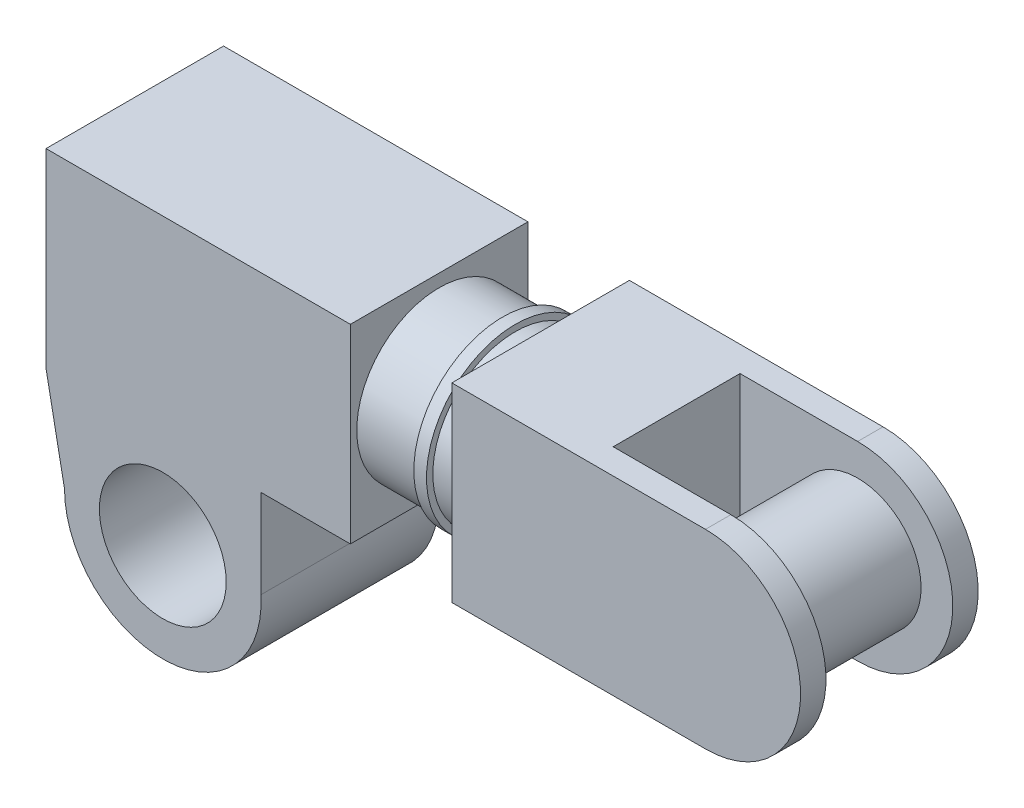
ISO-10303-21;
HEADER;
FILE_DESCRIPTION(('STEP AP214'),'2;1');
FILE_NAME('part.step','',(''),(''),'','','');
FILE_SCHEMA(('AUTOMOTIVE_DESIGN { 1 0 10303 214 1 1 1 1 }'));
ENDSEC;
DATA;
#1=APPLICATION_CONTEXT('core data for automotive mechanical design processes');
#2=APPLICATION_PROTOCOL_DEFINITION('international standard','automotive_design',2000,#1);
#3=PRODUCT_CONTEXT('',#1,'mechanical');
#4=PRODUCT('Part','Part','',(#3));
#5=PRODUCT_RELATED_PRODUCT_CATEGORY('part','',(#4));
#6=PRODUCT_DEFINITION_FORMATION('','',#4);
#7=PRODUCT_DEFINITION_CONTEXT('part definition',#1,'design');
#8=PRODUCT_DEFINITION('design','',#6,#7);
#9=PRODUCT_DEFINITION_SHAPE('','',#8);
#10=(LENGTH_UNIT() NAMED_UNIT(*) SI_UNIT(.MILLI.,.METRE.));
#11=(NAMED_UNIT(*) PLANE_ANGLE_UNIT() SI_UNIT($,.RADIAN.));
#12=(NAMED_UNIT(*) SI_UNIT($,.STERADIAN.) SOLID_ANGLE_UNIT());
#13=UNCERTAINTY_MEASURE_WITH_UNIT(LENGTH_MEASURE(1.E-05),#10,'distance_accuracy_value','');
#14=(GEOMETRIC_REPRESENTATION_CONTEXT(3) GLOBAL_UNCERTAINTY_ASSIGNED_CONTEXT((#13)) GLOBAL_UNIT_ASSIGNED_CONTEXT((#10,
#11,#12)) REPRESENTATION_CONTEXT('',''));
#15=CARTESIAN_POINT('',(0.,0.,0.));
#16=DIRECTION('',(0.,0.,1.));
#17=DIRECTION('',(1.,0.,0.));
#18=AXIS2_PLACEMENT_3D('',#15,#16,#17);
#19=CARTESIAN_POINT('',(5200.,-1.11022302462516E-13,700.));
#20=DIRECTION('',(0.,0.,-1.));
#21=DIRECTION('',(-1.,0.,0.));
#22=AXIS2_PLACEMENT_3D('',#19,#20,#21);
#23=CYLINDRICAL_SURFACE('',#22,750.);
#24=CARTESIAN_POINT('',(5200.,-1.11022302462516E-13,-500.));
#25=DIRECTION('',(0.,0.,1.));
#26=DIRECTION('',(1.,0.,0.));
#27=AXIS2_PLACEMENT_3D('',#24,#25,#26);
#28=CIRCLE('',#27,750.);
#29=CARTESIAN_POINT('',(5200.,-750.,-500.));
#30=VERTEX_POINT('',#29);
#31=CARTESIAN_POINT('',(5200.,750.,-500.));
#32=VERTEX_POINT('',#31);
#33=EDGE_CURVE('E153',#30,#32,#28,.T.);
#34=ORIENTED_EDGE('',*,*,#33,.F.);
#35=DIRECTION('',(0.,0.,-1.));
#36=VECTOR('',#35,1.);
#37=CARTESIAN_POINT('',(5200.,-750.,700.));
#38=LINE('',#37,#36);
#39=CARTESIAN_POINT('',(5200.,-750.,-700.));
#40=VERTEX_POINT('',#39);
#41=EDGE_CURVE('E365',#30,#40,#38,.T.);
#42=ORIENTED_EDGE('',*,*,#41,.T.);
#43=CARTESIAN_POINT('',(5200.,-1.11022302462516E-13,-700.));
#44=DIRECTION('',(0.,0.,1.));
#45=DIRECTION('',(1.,0.,0.));
#46=AXIS2_PLACEMENT_3D('',#43,#44,#45);
#47=CIRCLE('',#46,750.);
#48=CARTESIAN_POINT('',(5200.,750.,-700.));
#49=VERTEX_POINT('',#48);
#50=EDGE_CURVE('E178',#40,#49,#47,.T.);
#51=ORIENTED_EDGE('',*,*,#50,.T.);
#52=DIRECTION('',(0.,0.,-1.));
#53=VECTOR('',#52,1.);
#54=CARTESIAN_POINT('',(5200.,750.,700.));
#55=LINE('',#54,#53);
#56=EDGE_CURVE('E169',#32,#49,#55,.T.);
#57=ORIENTED_EDGE('',*,*,#56,.F.);
#58=EDGE_LOOP('',(#34,#42,#51,#57));
#59=FACE_BOUND('',#58,.T.);
#60=ADVANCED_FACE('F41',(#59),#23,.T.);
#61=CARTESIAN_POINT('',(5200.,750.,700.));
#62=DIRECTION('',(0.,-1.,0.));
#63=DIRECTION('',(1.,0.,0.));
#64=AXIS2_PLACEMENT_3D('',#61,#62,#63);
#65=PLANE('',#64);
#66=DIRECTION('',(-1.,0.,0.));
#67=VECTOR('',#66,1.);
#68=CARTESIAN_POINT('',(5200.,750.,-500.));
#69=LINE('',#68,#67);
#70=CARTESIAN_POINT('',(4272.37648470102,750.,-500.));
#71=VERTEX_POINT('',#70);
#72=EDGE_CURVE('E157',#32,#71,#69,.T.);
#73=ORIENTED_EDGE('',*,*,#72,.F.);
#74=ORIENTED_EDGE('',*,*,#56,.T.);
#75=DIRECTION('',(-1.,0.,0.));
#76=VECTOR('',#75,1.);
#77=CARTESIAN_POINT('',(5200.,750.,-700.));
#78=LINE('',#77,#76);
#79=CARTESIAN_POINT('',(3200.,750.,-700.));
#80=VERTEX_POINT('',#79);
#81=EDGE_CURVE('E379',#49,#80,#78,.T.);
#82=ORIENTED_EDGE('',*,*,#81,.T.);
#83=DIRECTION('',(0.,0.,-1.));
#84=VECTOR('',#83,1.);
#85=CARTESIAN_POINT('',(3200.,750.,700.));
#86=LINE('',#85,#84);
#87=CARTESIAN_POINT('',(3200.,750.,700.));
#88=VERTEX_POINT('',#87);
#89=EDGE_CURVE('E181',#88,#80,#86,.T.);
#90=ORIENTED_EDGE('',*,*,#89,.F.);
#91=DIRECTION('',(-1.,0.,0.));
#92=VECTOR('',#91,1.);
#93=CARTESIAN_POINT('',(5200.,750.,700.));
#94=LINE('',#93,#92);
#95=CARTESIAN_POINT('',(5200.,750.,700.));
#96=VERTEX_POINT('',#95);
#97=EDGE_CURVE('E390',#96,#88,#94,.T.);
#98=ORIENTED_EDGE('',*,*,#97,.F.);
#99=CARTESIAN_POINT('',(5200.,750.,500.));
#100=VERTEX_POINT('',#99);
#101=EDGE_CURVE('E180',#96,#100,#55,.T.);
#102=ORIENTED_EDGE('',*,*,#101,.T.);
#103=DIRECTION('',(-1.,0.,0.));
#104=VECTOR('',#103,1.);
#105=CARTESIAN_POINT('',(5200.,750.,500.));
#106=LINE('',#105,#104);
#107=CARTESIAN_POINT('',(4272.37648470102,750.,500.));
#108=VERTEX_POINT('',#107);
#109=EDGE_CURVE('E405',#100,#108,#106,.T.);
#110=ORIENTED_EDGE('',*,*,#109,.T.);
#111=DIRECTION('',(0.,0.,1.));
#112=VECTOR('',#111,1.);
#113=CARTESIAN_POINT('',(4272.37648470102,750.,-500.));
#114=LINE('',#113,#112);
#115=EDGE_CURVE('E172',#71,#108,#114,.T.);
#116=ORIENTED_EDGE('',*,*,#115,.F.);
#117=EDGE_LOOP('',(#73,#74,#82,#90,#98,#102,#110,#116));
#118=FACE_BOUND('',#117,.T.);
#119=ADVANCED_FACE('F168',(#118),#65,.F.);
#120=CARTESIAN_POINT('',(3200.,-750.,700.));
#121=DIRECTION('',(0.,1.,0.));
#122=DIRECTION('',(-1.,0.,0.));
#123=AXIS2_PLACEMENT_3D('',#120,#121,#122);
#124=PLANE('',#123);
#125=DIRECTION('',(1.,0.,0.));
#126=VECTOR('',#125,1.);
#127=CARTESIAN_POINT('',(5200.,-750.,-500.));
#128=LINE('',#127,#126);
#129=CARTESIAN_POINT('',(4272.37648470102,-750.,-500.));
#130=VERTEX_POINT('',#129);
#131=EDGE_CURVE('E160',#130,#30,#128,.T.);
#132=ORIENTED_EDGE('',*,*,#131,.F.);
#133=DIRECTION('',(0.,0.,1.));
#134=VECTOR('',#133,1.);
#135=CARTESIAN_POINT('',(4272.37648470102,-750.,-500.));
#136=LINE('',#135,#134);
#137=CARTESIAN_POINT('',(4272.37648470102,-750.,500.));
#138=VERTEX_POINT('',#137);
#139=EDGE_CURVE('E384',#130,#138,#136,.T.);
#140=ORIENTED_EDGE('',*,*,#139,.T.);
#141=DIRECTION('',(1.,0.,0.));
#142=VECTOR('',#141,1.);
#143=CARTESIAN_POINT('',(5200.,-750.,500.));
#144=LINE('',#143,#142);
#145=CARTESIAN_POINT('',(5200.,-750.,500.));
#146=VERTEX_POINT('',#145);
#147=EDGE_CURVE('E165',#138,#146,#144,.T.);
#148=ORIENTED_EDGE('',*,*,#147,.T.);
#149=CARTESIAN_POINT('',(5200.,-750.,700.));
#150=VERTEX_POINT('',#149);
#151=EDGE_CURVE('E358',#150,#146,#38,.T.);
#152=ORIENTED_EDGE('',*,*,#151,.F.);
#153=DIRECTION('',(1.,0.,0.));
#154=VECTOR('',#153,1.);
#155=CARTESIAN_POINT('',(3200.,-750.,700.));
#156=LINE('',#155,#154);
#157=CARTESIAN_POINT('',(3200.,-750.,700.));
#158=VERTEX_POINT('',#157);
#159=EDGE_CURVE('E370',#158,#150,#156,.T.);
#160=ORIENTED_EDGE('',*,*,#159,.F.);
#161=DIRECTION('',(0.,0.,-1.));
#162=VECTOR('',#161,1.);
#163=CARTESIAN_POINT('',(3200.,-750.,700.));
#164=LINE('',#163,#162);
#165=CARTESIAN_POINT('',(3200.,-750.,-700.));
#166=VERTEX_POINT('',#165);
#167=EDGE_CURVE('E188',#158,#166,#164,.T.);
#168=ORIENTED_EDGE('',*,*,#167,.T.);
#169=DIRECTION('',(1.,0.,0.));
#170=VECTOR('',#169,1.);
#171=CARTESIAN_POINT('',(3200.,-750.,-700.));
#172=LINE('',#171,#170);
#173=EDGE_CURVE('E372',#166,#40,#172,.T.);
#174=ORIENTED_EDGE('',*,*,#173,.T.);
#175=ORIENTED_EDGE('',*,*,#41,.F.);
#176=EDGE_LOOP('',(#132,#140,#148,#152,#160,#168,#174,#175));
#177=FACE_BOUND('',#176,.T.);
#178=ADVANCED_FACE('F339',(#177),#124,.F.);
#179=CARTESIAN_POINT('',(2400.,-750.,-700.));
#180=DIRECTION('',(0.,1.,0.));
#181=DIRECTION('',(0.,0.,1.));
#182=AXIS2_PLACEMENT_3D('',#179,#180,#181);
#183=PLANE('',#182);
#184=DIRECTION('',(0.,0.,1.));
#185=VECTOR('',#184,1.);
#186=CARTESIAN_POINT('',(1695.78523185329,-750.,-700.));
#187=LINE('',#186,#185);
#188=CARTESIAN_POINT('',(1695.78523185329,-750.,-700.));
#189=VERTEX_POINT('',#188);
#190=CARTESIAN_POINT('',(1695.78523185329,-750.,700.));
#191=VERTEX_POINT('',#190);
#192=EDGE_CURVE('E67',#189,#191,#187,.T.);
#193=ORIENTED_EDGE('',*,*,#192,.F.);
#194=DIRECTION('',(-1.,0.,0.));
#195=VECTOR('',#194,1.);
#196=CARTESIAN_POINT('',(2400.,-750.,-700.));
#197=LINE('',#196,#195);
#198=CARTESIAN_POINT('',(2400.,-750.,-700.));
#199=VERTEX_POINT('',#198);
#200=EDGE_CURVE('E289',#199,#189,#197,.T.);
#201=ORIENTED_EDGE('',*,*,#200,.F.);
#202=DIRECTION('',(0.,0.,-1.));
#203=VECTOR('',#202,1.);
#204=CARTESIAN_POINT('',(2400.,-750.,-700.));
#205=LINE('',#204,#203);
#206=CARTESIAN_POINT('',(2400.,-750.,700.));
#207=VERTEX_POINT('',#206);
#208=EDGE_CURVE('E259',#207,#199,#205,.T.);
#209=ORIENTED_EDGE('',*,*,#208,.F.);
#210=DIRECTION('',(-1.,0.,0.));
#211=VECTOR('',#210,1.);
#212=CARTESIAN_POINT('',(2400.,-750.,700.));
#213=LINE('',#212,#211);
#214=EDGE_CURVE('E254',#207,#191,#213,.T.);
#215=ORIENTED_EDGE('',*,*,#214,.T.);
#216=EDGE_LOOP('',(#193,#201,#209,#215));
#217=FACE_BOUND('',#216,.T.);
#218=ADVANCED_FACE('F294',(#217),#183,.F.);
#219=CARTESIAN_POINT('',(2400.,750.,700.));
#220=DIRECTION('',(0.,0.,-1.));
#221=DIRECTION('',(0.,1.,0.));
#222=AXIS2_PLACEMENT_3D('',#219,#220,#221);
#223=PLANE('',#222);
#224=DIRECTION('',(0.,-1.,0.));
#225=VECTOR('',#224,1.);
#226=CARTESIAN_POINT('',(0.,750.,700.));
#227=LINE('',#226,#225);
#228=CARTESIAN_POINT('',(0.,750.,700.));
#229=VERTEX_POINT('',#228);
#230=CARTESIAN_POINT('',(0.,-750.,700.));
#231=VERTEX_POINT('',#230);
#232=EDGE_CURVE('E250',#229,#231,#227,.T.);
#233=ORIENTED_EDGE('',*,*,#232,.T.);
#234=DIRECTION('',(0.190808995376546,-0.981627183447664,0.));
#235=VECTOR('',#234,1.);
#236=CARTESIAN_POINT('',(-140.477472530968,-27.306054537455,700.));
#237=LINE('',#236,#235);
#238=CARTESIAN_POINT('',(145.785231853289,-1500.,700.));
#239=VERTEX_POINT('',#238);
#240=EDGE_CURVE('E220',#231,#239,#237,.T.);
#241=ORIENTED_EDGE('',*,*,#240,.T.);
#242=CARTESIAN_POINT('',(920.785231853289,-1500.,700.));
#243=DIRECTION('',(0.,0.,1.));
#244=DIRECTION('',(1.,0.,0.));
#245=AXIS2_PLACEMENT_3D('',#242,#243,#244);
#246=CIRCLE('',#245,775.);
#247=CARTESIAN_POINT('',(1694.17064676619,-1450.,700.));
#248=VERTEX_POINT('',#247);
#249=EDGE_CURVE('E224',#239,#248,#246,.T.);
#250=ORIENTED_EDGE('',*,*,#249,.T.);
#251=DIRECTION('',(-0.00230654398882854,-0.999997339923876,0.));
#252=VECTOR('',#251,1.);
#253=CARTESIAN_POINT('',(1697.50611341961,-3.91538293712437,700.));
#254=LINE('',#253,#252);
#255=EDGE_CURVE('E205',#191,#248,#254,.T.);
#256=ORIENTED_EDGE('',*,*,#255,.F.);
#257=ORIENTED_EDGE('',*,*,#214,.F.);
#258=DIRECTION('',(0.,-1.,0.));
#259=VECTOR('',#258,1.);
#260=CARTESIAN_POINT('',(2400.,750.,700.));
#261=LINE('',#260,#259);
#262=CARTESIAN_POINT('',(2400.,750.,700.));
#263=VERTEX_POINT('',#262);
#264=EDGE_CURVE('E255',#263,#207,#261,.T.);
#265=ORIENTED_EDGE('',*,*,#264,.F.);
#266=DIRECTION('',(-1.,0.,0.));
#267=VECTOR('',#266,1.);
#268=CARTESIAN_POINT('',(2400.,750.,700.));
#269=LINE('',#268,#267);
#270=EDGE_CURVE('E269',#263,#229,#269,.T.);
#271=ORIENTED_EDGE('',*,*,#270,.T.);
#272=EDGE_LOOP('',(#233,#241,#250,#256,#257,#265,#271));
#273=FACE_BOUND('',#272,.T.);
#274=CARTESIAN_POINT('',(920.785231853289,-1500.,700.));
#275=DIRECTION('',(0.,0.,1.));
#276=DIRECTION('',(1.,0.,0.));
#277=AXIS2_PLACEMENT_3D('',#274,#275,#276);
#278=CIRCLE('',#277,500.000000000001);
#279=CARTESIAN_POINT('',(1420.78523185329,-1500.,700.));
#280=VERTEX_POINT('',#279);
#281=EDGE_CURVE('E195',#280,#280,#278,.T.);
#282=ORIENTED_EDGE('',*,*,#281,.F.);
#283=EDGE_LOOP('',(#282));
#284=FACE_BOUND('',#283,.T.);
#285=ADVANCED_FACE('F43',(#273,#284),#223,.F.);
#286=CARTESIAN_POINT('',(2400.,750.,-700.));
#287=DIRECTION('',(0.,0.,1.));
#288=DIRECTION('',(0.,-1.,0.));
#289=AXIS2_PLACEMENT_3D('',#286,#287,#288);
#290=PLANE('',#289);
#291=DIRECTION('',(0.,1.,0.));
#292=VECTOR('',#291,1.);
#293=CARTESIAN_POINT('',(0.,750.,-700.));
#294=LINE('',#293,#292);
#295=CARTESIAN_POINT('',(0.,-750.,-700.));
#296=VERTEX_POINT('',#295);
#297=CARTESIAN_POINT('',(0.,750.,-700.));
#298=VERTEX_POINT('',#297);
#299=EDGE_CURVE('E277',#296,#298,#294,.T.);
#300=ORIENTED_EDGE('',*,*,#299,.T.);
#301=DIRECTION('',(-1.,0.,0.));
#302=VECTOR('',#301,1.);
#303=CARTESIAN_POINT('',(2400.,750.,-700.));
#304=LINE('',#303,#302);
#305=CARTESIAN_POINT('',(2400.,750.,-700.));
#306=VERTEX_POINT('',#305);
#307=EDGE_CURVE('E285',#306,#298,#304,.T.);
#308=ORIENTED_EDGE('',*,*,#307,.F.);
#309=DIRECTION('',(0.,1.,0.));
#310=VECTOR('',#309,1.);
#311=CARTESIAN_POINT('',(2400.,750.,-700.));
#312=LINE('',#311,#310);
#313=EDGE_CURVE('E263',#199,#306,#312,.T.);
#314=ORIENTED_EDGE('',*,*,#313,.F.);
#315=ORIENTED_EDGE('',*,*,#200,.T.);
#316=DIRECTION('',(-0.00230654398882854,-0.999997339923876,0.));
#317=VECTOR('',#316,1.);
#318=CARTESIAN_POINT('',(1697.50611341961,-3.91538293712437,-700.));
#319=LINE('',#318,#317);
#320=CARTESIAN_POINT('',(1694.17064676619,-1450.,-700.));
#321=VERTEX_POINT('',#320);
#322=EDGE_CURVE('E213',#189,#321,#319,.T.);
#323=ORIENTED_EDGE('',*,*,#322,.T.);
#324=CARTESIAN_POINT('',(920.785231853289,-1500.,-700.));
#325=DIRECTION('',(0.,0.,1.));
#326=DIRECTION('',(1.,0.,0.));
#327=AXIS2_PLACEMENT_3D('',#324,#325,#326);
#328=CIRCLE('',#327,775.);
#329=CARTESIAN_POINT('',(145.785231853289,-1500.,-700.));
#330=VERTEX_POINT('',#329);
#331=EDGE_CURVE('E209',#330,#321,#328,.T.);
#332=ORIENTED_EDGE('',*,*,#331,.F.);
#333=DIRECTION('',(0.190808995376546,-0.981627183447664,0.));
#334=VECTOR('',#333,1.);
#335=CARTESIAN_POINT('',(-140.477472530968,-27.306054537455,-700.));
#336=LINE('',#335,#334);
#337=EDGE_CURVE('E204',#296,#330,#336,.T.);
#338=ORIENTED_EDGE('',*,*,#337,.F.);
#339=EDGE_LOOP('',(#300,#308,#314,#315,#323,#332,#338));
#340=FACE_BOUND('',#339,.T.);
#341=CARTESIAN_POINT('',(920.785231853289,-1500.,-700.));
#342=DIRECTION('',(0.,0.,1.));
#343=DIRECTION('',(1.,0.,0.));
#344=AXIS2_PLACEMENT_3D('',#341,#342,#343);
#345=CIRCLE('',#344,500.000000000001);
#346=CARTESIAN_POINT('',(1420.78523185329,-1500.,-700.));
#347=VERTEX_POINT('',#346);
#348=EDGE_CURVE('E200',#347,#347,#345,.T.);
#349=ORIENTED_EDGE('',*,*,#348,.T.);
#350=EDGE_LOOP('',(#349));
#351=FACE_BOUND('',#350,.T.);
#352=ADVANCED_FACE('F305',(#340,#351),#290,.F.);
#353=CARTESIAN_POINT('',(2400.,750.,-700.));
#354=DIRECTION('',(0.,-1.,0.));
#355=DIRECTION('',(0.,0.,-1.));
#356=AXIS2_PLACEMENT_3D('',#353,#354,#355);
#357=PLANE('',#356);
#358=DIRECTION('',(0.,0.,1.));
#359=VECTOR('',#358,1.);
#360=CARTESIAN_POINT('',(0.,750.,-700.));
#361=LINE('',#360,#359);
#362=EDGE_CURVE('E260',#298,#229,#361,.T.);
#363=ORIENTED_EDGE('',*,*,#362,.T.);
#364=ORIENTED_EDGE('',*,*,#270,.F.);
#365=DIRECTION('',(0.,0.,1.));
#366=VECTOR('',#365,1.);
#367=CARTESIAN_POINT('',(2400.,750.,-700.));
#368=LINE('',#367,#366);
#369=EDGE_CURVE('E266',#306,#263,#368,.T.);
#370=ORIENTED_EDGE('',*,*,#369,.F.);
#371=ORIENTED_EDGE('',*,*,#307,.T.);
#372=EDGE_LOOP('',(#363,#364,#370,#371));
#373=FACE_BOUND('',#372,.T.);
#374=ADVANCED_FACE('F322',(#373),#357,.F.);
#375=CARTESIAN_POINT('',(2400.,0.,0.));
#376=DIRECTION('',(-1.,0.,0.));
#377=DIRECTION('',(0.,0.,1.));
#378=AXIS2_PLACEMENT_3D('',#375,#376,#377);
#379=PLANE('',#378);
#380=CARTESIAN_POINT('',(2400.,0.,0.));
#381=DIRECTION('',(1.,0.,0.));
#382=DIRECTION('',(0.,0.,-1.));
#383=AXIS2_PLACEMENT_3D('',#380,#381,#382);
#384=CIRCLE('',#383,650.);
#385=CARTESIAN_POINT('',(2400.,0.,-650.));
#386=VERTEX_POINT('',#385);
#387=EDGE_CURVE('E199',#386,#386,#384,.T.);
#388=ORIENTED_EDGE('',*,*,#387,.F.);
#389=EDGE_LOOP('',(#388));
#390=FACE_BOUND('',#389,.T.);
#391=ORIENTED_EDGE('',*,*,#264,.T.);
#392=ORIENTED_EDGE('',*,*,#208,.T.);
#393=ORIENTED_EDGE('',*,*,#313,.T.);
#394=ORIENTED_EDGE('',*,*,#369,.T.);
#395=EDGE_LOOP('',(#391,#392,#393,#394));
#396=FACE_BOUND('',#395,.T.);
#397=ADVANCED_FACE('F312',(#390,#396),#379,.F.);
#398=CARTESIAN_POINT('',(0.,0.,0.));
#399=DIRECTION('',(-1.,0.,0.));
#400=DIRECTION('',(0.,0.,1.));
#401=AXIS2_PLACEMENT_3D('',#398,#399,#400);
#402=PLANE('',#401);
#403=ORIENTED_EDGE('',*,*,#232,.F.);
#404=ORIENTED_EDGE('',*,*,#362,.F.);
#405=ORIENTED_EDGE('',*,*,#299,.F.);
#406=DIRECTION('',(0.,0.,-1.));
#407=VECTOR('',#406,1.);
#408=CARTESIAN_POINT('',(0.,-750.,-700.));
#409=LINE('',#408,#407);
#410=EDGE_CURVE('E273',#231,#296,#409,.T.);
#411=ORIENTED_EDGE('',*,*,#410,.F.);
#412=EDGE_LOOP('',(#403,#404,#405,#411));
#413=FACE_BOUND('',#412,.T.);
#414=ADVANCED_FACE('F319',(#413),#402,.T.);
#415=CARTESIAN_POINT('',(2900.,0.,0.));
#416=DIRECTION('',(-1.,0.,0.));
#417=DIRECTION('',(0.,0.,1.));
#418=AXIS2_PLACEMENT_3D('',#415,#416,#417);
#419=CYLINDRICAL_SURFACE('',#418,650.);
#420=CARTESIAN_POINT('',(2900.,0.,0.));
#421=DIRECTION('',(1.,0.,0.));
#422=DIRECTION('',(0.,0.,-1.));
#423=AXIS2_PLACEMENT_3D('',#420,#421,#422);
#424=CIRCLE('',#423,650.);
#425=CARTESIAN_POINT('',(2900.,0.,-650.));
#426=VERTEX_POINT('',#425);
#427=EDGE_CURVE('E243',#426,#426,#424,.T.);
#428=ORIENTED_EDGE('',*,*,#427,.F.);
#429=EDGE_LOOP('',(#428));
#430=FACE_BOUND('',#429,.T.);
#431=ORIENTED_EDGE('',*,*,#387,.T.);
#432=EDGE_LOOP('',(#431));
#433=FACE_BOUND('',#432,.T.);
#434=ADVANCED_FACE('F463',(#430,#433),#419,.T.);
#435=CARTESIAN_POINT('',(3000.,0.,0.));
#436=DIRECTION('',(-1.,0.,0.));
#437=DIRECTION('',(0.,0.,1.));
#438=AXIS2_PLACEMENT_3D('',#435,#436,#437);
#439=CYLINDRICAL_SURFACE('',#438,700.);
#440=CARTESIAN_POINT('',(3000.,0.,0.));
#441=DIRECTION('',(1.,0.,0.));
#442=DIRECTION('',(0.,0.,-1.));
#443=AXIS2_PLACEMENT_3D('',#440,#441,#442);
#444=CIRCLE('',#443,700.);
#445=CARTESIAN_POINT('',(3000.,0.,-700.));
#446=VERTEX_POINT('',#445);
#447=EDGE_CURVE('E239',#446,#446,#444,.T.);
#448=ORIENTED_EDGE('',*,*,#447,.F.);
#449=EDGE_LOOP('',(#448));
#450=FACE_BOUND('',#449,.T.);
#451=CARTESIAN_POINT('',(2900.,0.,0.));
#452=DIRECTION('',(1.,0.,0.));
#453=DIRECTION('',(0.,0.,-1.));
#454=AXIS2_PLACEMENT_3D('',#451,#452,#453);
#455=CIRCLE('',#454,700.);
#456=CARTESIAN_POINT('',(2900.,0.,-700.));
#457=VERTEX_POINT('',#456);
#458=EDGE_CURVE('E233',#457,#457,#455,.T.);
#459=ORIENTED_EDGE('',*,*,#458,.T.);
#460=EDGE_LOOP('',(#459));
#461=FACE_BOUND('',#460,.T.);
#462=ADVANCED_FACE('F512',(#450,#461),#439,.T.);
#463=CARTESIAN_POINT('',(3000.,0.,0.));
#464=DIRECTION('',(1.,0.,0.));
#465=DIRECTION('',(0.,0.,-1.));
#466=AXIS2_PLACEMENT_3D('',#463,#464,#465);
#467=PLANE('',#466);
#468=CARTESIAN_POINT('',(3000.,0.,0.));
#469=DIRECTION('',(1.,0.,0.));
#470=DIRECTION('',(0.,0.,-1.));
#471=AXIS2_PLACEMENT_3D('',#468,#469,#470);
#472=CIRCLE('',#471,650.);
#473=CARTESIAN_POINT('',(3000.,0.,-650.));
#474=VERTEX_POINT('',#473);
#475=EDGE_CURVE('E51',#474,#474,#472,.T.);
#476=ORIENTED_EDGE('',*,*,#475,.F.);
#477=EDGE_LOOP('',(#476));
#478=FACE_BOUND('',#477,.T.);
#479=ORIENTED_EDGE('',*,*,#447,.T.);
#480=EDGE_LOOP('',(#479));
#481=FACE_BOUND('',#480,.T.);
#482=ADVANCED_FACE('F507',(#478,#481),#467,.T.);
#483=CARTESIAN_POINT('',(2900.,0.,0.));
#484=DIRECTION('',(1.,0.,0.));
#485=DIRECTION('',(0.,0.,-1.));
#486=AXIS2_PLACEMENT_3D('',#483,#484,#485);
#487=PLANE('',#486);
#488=ORIENTED_EDGE('',*,*,#427,.T.);
#489=EDGE_LOOP('',(#488));
#490=FACE_BOUND('',#489,.T.);
#491=ORIENTED_EDGE('',*,*,#458,.F.);
#492=EDGE_LOOP('',(#491));
#493=FACE_BOUND('',#492,.T.);
#494=ADVANCED_FACE('F473',(#490,#493),#487,.F.);
#495=CARTESIAN_POINT('',(-140.477472530968,-27.306054537455,-700.));
#496=DIRECTION('',(-0.981627183447664,-0.190808995376546,0.));
#497=DIRECTION('',(0.190808995376546,-0.981627183447664,0.));
#498=AXIS2_PLACEMENT_3D('',#495,#496,#497);
#499=PLANE('',#498);
#500=ORIENTED_EDGE('',*,*,#240,.F.);
#501=ORIENTED_EDGE('',*,*,#410,.T.);
#502=ORIENTED_EDGE('',*,*,#337,.T.);
#503=DIRECTION('',(0.,0.,1.));
#504=VECTOR('',#503,1.);
#505=CARTESIAN_POINT('',(145.785231853289,-1500.,-700.));
#506=LINE('',#505,#504);
#507=EDGE_CURVE('E216',#330,#239,#506,.T.);
#508=ORIENTED_EDGE('',*,*,#507,.T.);
#509=EDGE_LOOP('',(#500,#501,#502,#508));
#510=FACE_BOUND('',#509,.T.);
#511=ADVANCED_FACE('F321',(#510),#499,.T.);
#512=CARTESIAN_POINT('',(1697.50611341961,-3.91538293712437,-700.));
#513=DIRECTION('',(-0.999997339923876,0.00230654398882854,0.));
#514=DIRECTION('',(-0.00230654398882854,-0.999997339923876,0.));
#515=AXIS2_PLACEMENT_3D('',#512,#513,#514);
#516=PLANE('',#515);
#517=ORIENTED_EDGE('',*,*,#255,.T.);
#518=DIRECTION('',(0.,0.,1.));
#519=VECTOR('',#518,1.);
#520=CARTESIAN_POINT('',(1694.17064676619,-1450.,-700.));
#521=LINE('',#520,#519);
#522=EDGE_CURVE('E234',#321,#248,#521,.T.);
#523=ORIENTED_EDGE('',*,*,#522,.F.);
#524=ORIENTED_EDGE('',*,*,#322,.F.);
#525=ORIENTED_EDGE('',*,*,#192,.T.);
#526=EDGE_LOOP('',(#517,#523,#524,#525));
#527=FACE_BOUND('',#526,.T.);
#528=ADVANCED_FACE('F302',(#527),#516,.F.);
#529=CARTESIAN_POINT('',(920.785231853289,-1500.,-700.));
#530=DIRECTION('',(0.,0.,1.));
#531=DIRECTION('',(1.,0.,0.));
#532=AXIS2_PLACEMENT_3D('',#529,#530,#531);
#533=CYLINDRICAL_SURFACE('',#532,500.000000000001);
#534=ORIENTED_EDGE('',*,*,#348,.F.);
#535=EDGE_LOOP('',(#534));
#536=FACE_BOUND('',#535,.T.);
#537=ORIENTED_EDGE('',*,*,#281,.T.);
#538=EDGE_LOOP('',(#537));
#539=FACE_BOUND('',#538,.T.);
#540=ADVANCED_FACE('F483',(#536,#539),#533,.F.);
#541=CARTESIAN_POINT('',(920.785231853289,-1500.,-700.));
#542=DIRECTION('',(0.,0.,1.));
#543=DIRECTION('',(1.,0.,0.));
#544=AXIS2_PLACEMENT_3D('',#541,#542,#543);
#545=CYLINDRICAL_SURFACE('',#544,775.);
#546=ORIENTED_EDGE('',*,*,#249,.F.);
#547=ORIENTED_EDGE('',*,*,#507,.F.);
#548=ORIENTED_EDGE('',*,*,#331,.T.);
#549=ORIENTED_EDGE('',*,*,#522,.T.);
#550=EDGE_LOOP('',(#546,#547,#548,#549));
#551=FACE_BOUND('',#550,.T.);
#552=ADVANCED_FACE('F353',(#551),#545,.T.);
#553=CARTESIAN_POINT('',(3200.,0.,0.));
#554=DIRECTION('',(-1.,0.,0.));
#555=DIRECTION('',(0.,0.,1.));
#556=AXIS2_PLACEMENT_3D('',#553,#554,#555);
#557=CYLINDRICAL_SURFACE('',#556,650.);
#558=CARTESIAN_POINT('',(3200.,0.,0.));
#559=DIRECTION('',(1.,0.,0.));
#560=DIRECTION('',(0.,0.,-1.));
#561=AXIS2_PLACEMENT_3D('',#558,#559,#560);
#562=CIRCLE('',#561,650.);
#563=CARTESIAN_POINT('',(3200.,0.,-650.));
#564=VERTEX_POINT('',#563);
#565=EDGE_CURVE('E186',#564,#564,#562,.T.);
#566=ORIENTED_EDGE('',*,*,#565,.F.);
#567=EDGE_LOOP('',(#566));
#568=FACE_BOUND('',#567,.T.);
#569=ORIENTED_EDGE('',*,*,#475,.T.);
#570=EDGE_LOOP('',(#569));
#571=FACE_BOUND('',#570,.T.);
#572=ADVANCED_FACE('F344',(#568,#571),#557,.T.);
#573=ORIENTED_EDGE('',*,*,#151,.T.);
#574=CARTESIAN_POINT('',(5200.,-1.11022302462516E-13,500.));
#575=DIRECTION('',(0.,0.,1.));
#576=DIRECTION('',(1.,0.,0.));
#577=AXIS2_PLACEMENT_3D('',#574,#575,#576);
#578=CIRCLE('',#577,750.);
#579=EDGE_CURVE('E59',#146,#100,#578,.T.);
#580=ORIENTED_EDGE('',*,*,#579,.T.);
#581=ORIENTED_EDGE('',*,*,#101,.F.);
#582=CARTESIAN_POINT('',(5200.,-1.11022302462516E-13,700.));
#583=DIRECTION('',(0.,0.,1.));
#584=DIRECTION('',(1.,0.,0.));
#585=AXIS2_PLACEMENT_3D('',#582,#583,#584);
#586=CIRCLE('',#585,750.);
#587=EDGE_CURVE('E361',#150,#96,#586,.T.);
#588=ORIENTED_EDGE('',*,*,#587,.F.);
#589=EDGE_LOOP('',(#573,#580,#581,#588));
#590=FACE_BOUND('',#589,.T.);
#591=ADVANCED_FACE('F335',(#590),#23,.T.);
#592=CARTESIAN_POINT('',(3200.,750.,700.));
#593=DIRECTION('',(1.,0.,0.));
#594=DIRECTION('',(0.,0.,-1.));
#595=AXIS2_PLACEMENT_3D('',#592,#593,#594);
#596=PLANE('',#595);
#597=ORIENTED_EDGE('',*,*,#565,.T.);
#598=EDGE_LOOP('',(#597));
#599=FACE_BOUND('',#598,.T.);
#600=DIRECTION('',(0.,-1.,0.));
#601=VECTOR('',#600,1.);
#602=CARTESIAN_POINT('',(3200.,750.,-700.));
#603=LINE('',#602,#601);
#604=EDGE_CURVE('E376',#80,#166,#603,.T.);
#605=ORIENTED_EDGE('',*,*,#604,.T.);
#606=ORIENTED_EDGE('',*,*,#167,.F.);
#607=DIRECTION('',(0.,-1.,0.));
#608=VECTOR('',#607,1.);
#609=CARTESIAN_POINT('',(3200.,750.,700.));
#610=LINE('',#609,#608);
#611=EDGE_CURVE('E387',#88,#158,#610,.T.);
#612=ORIENTED_EDGE('',*,*,#611,.F.);
#613=ORIENTED_EDGE('',*,*,#89,.T.);
#614=EDGE_LOOP('',(#605,#606,#612,#613));
#615=FACE_BOUND('',#614,.T.);
#616=ADVANCED_FACE('F343',(#599,#615),#596,.F.);
#617=CARTESIAN_POINT('',(5200.,-1.11022302462516E-13,700.));
#618=DIRECTION('',(0.,0.,1.));
#619=DIRECTION('',(1.,0.,0.));
#620=AXIS2_PLACEMENT_3D('',#617,#618,#619);
#621=PLANE('',#620);
#622=ORIENTED_EDGE('',*,*,#587,.T.);
#623=ORIENTED_EDGE('',*,*,#97,.T.);
#624=ORIENTED_EDGE('',*,*,#611,.T.);
#625=ORIENTED_EDGE('',*,*,#159,.T.);
#626=EDGE_LOOP('',(#622,#623,#624,#625));
#627=FACE_BOUND('',#626,.T.);
#628=ADVANCED_FACE('F350',(#627),#621,.T.);
#629=CARTESIAN_POINT('',(5200.,-1.11022302462516E-13,-700.));
#630=DIRECTION('',(0.,0.,1.));
#631=DIRECTION('',(1.,0.,0.));
#632=AXIS2_PLACEMENT_3D('',#629,#630,#631);
#633=PLANE('',#632);
#634=ORIENTED_EDGE('',*,*,#50,.F.);
#635=ORIENTED_EDGE('',*,*,#173,.F.);
#636=ORIENTED_EDGE('',*,*,#604,.F.);
#637=ORIENTED_EDGE('',*,*,#81,.F.);
#638=EDGE_LOOP('',(#634,#635,#636,#637));
#639=FACE_BOUND('',#638,.T.);
#640=ADVANCED_FACE('F418',(#639),#633,.F.);
#641=CARTESIAN_POINT('',(4272.37648470102,750.,-500.));
#642=DIRECTION('',(-1.,0.,0.));
#643=DIRECTION('',(0.,0.,1.));
#644=AXIS2_PLACEMENT_3D('',#641,#642,#643);
#645=PLANE('',#644);
#646=DIRECTION('',(0.,-1.,0.));
#647=VECTOR('',#646,1.);
#648=CARTESIAN_POINT('',(4272.37648470102,750.,500.));
#649=LINE('',#648,#647);
#650=EDGE_CURVE('E402',#108,#138,#649,.T.);
#651=ORIENTED_EDGE('',*,*,#650,.T.);
#652=ORIENTED_EDGE('',*,*,#139,.F.);
#653=DIRECTION('',(0.,-1.,0.));
#654=VECTOR('',#653,1.);
#655=CARTESIAN_POINT('',(4272.37648470102,750.,-500.));
#656=LINE('',#655,#654);
#657=EDGE_CURVE('E174',#71,#130,#656,.T.);
#658=ORIENTED_EDGE('',*,*,#657,.F.);
#659=ORIENTED_EDGE('',*,*,#115,.T.);
#660=EDGE_LOOP('',(#651,#652,#658,#659));
#661=FACE_BOUND('',#660,.T.);
#662=ADVANCED_FACE('F425',(#661),#645,.F.);
#663=CARTESIAN_POINT('',(5200.,-1.11022302462516E-13,-500.));
#664=DIRECTION('',(0.,0.,1.));
#665=DIRECTION('',(1.,0.,0.));
#666=AXIS2_PLACEMENT_3D('',#663,#664,#665);
#667=PLANE('',#666);
#668=CARTESIAN_POINT('',(5200.,-1.11022302462516E-13,-500.));
#669=DIRECTION('',(0.,0.,1.));
#670=DIRECTION('',(1.,0.,0.));
#671=AXIS2_PLACEMENT_3D('',#668,#669,#670);
#672=CIRCLE('',#671,500.);
#673=CARTESIAN_POINT('',(5700.,-1.11022302462516E-13,-500.));
#674=VERTEX_POINT('',#673);
#675=EDGE_CURVE('E11',#674,#674,#672,.T.);
#676=ORIENTED_EDGE('',*,*,#675,.F.);
#677=EDGE_LOOP('',(#676));
#678=FACE_BOUND('',#677,.T.);
#679=ORIENTED_EDGE('',*,*,#33,.T.);
#680=ORIENTED_EDGE('',*,*,#72,.T.);
#681=ORIENTED_EDGE('',*,*,#657,.T.);
#682=ORIENTED_EDGE('',*,*,#131,.T.);
#683=EDGE_LOOP('',(#679,#680,#681,#682));
#684=FACE_BOUND('',#683,.T.);
#685=ADVANCED_FACE('F155',(#678,#684),#667,.T.);
#686=CARTESIAN_POINT('',(5200.,-1.11022302462516E-13,500.));
#687=DIRECTION('',(0.,0.,1.));
#688=DIRECTION('',(1.,0.,0.));
#689=AXIS2_PLACEMENT_3D('',#686,#687,#688);
#690=PLANE('',#689);
#691=CARTESIAN_POINT('',(5200.,-1.11022302462516E-13,500.));
#692=DIRECTION('',(0.,0.,1.));
#693=DIRECTION('',(1.,0.,0.));
#694=AXIS2_PLACEMENT_3D('',#691,#692,#693);
#695=CIRCLE('',#694,500.);
#696=CARTESIAN_POINT('',(5700.,-1.11022302462516E-13,500.));
#697=VERTEX_POINT('',#696);
#698=EDGE_CURVE('E45',#697,#697,#695,.T.);
#699=ORIENTED_EDGE('',*,*,#698,.T.);
#700=EDGE_LOOP('',(#699));
#701=FACE_BOUND('',#700,.T.);
#702=ORIENTED_EDGE('',*,*,#579,.F.);
#703=ORIENTED_EDGE('',*,*,#147,.F.);
#704=ORIENTED_EDGE('',*,*,#650,.F.);
#705=ORIENTED_EDGE('',*,*,#109,.F.);
#706=EDGE_LOOP('',(#702,#703,#704,#705));
#707=FACE_BOUND('',#706,.T.);
#708=ADVANCED_FACE('F424',(#701,#707),#690,.F.);
#709=CARTESIAN_POINT('',(5200.,-1.11022302462516E-13,-700.));
#710=DIRECTION('',(0.,0.,1.));
#711=DIRECTION('',(1.,0.,0.));
#712=AXIS2_PLACEMENT_3D('',#709,#710,#711);
#713=CYLINDRICAL_SURFACE('',#712,500.);
#714=ORIENTED_EDGE('',*,*,#675,.T.);
#715=EDGE_LOOP('',(#714));
#716=FACE_BOUND('',#715,.T.);
#717=ORIENTED_EDGE('',*,*,#698,.F.);
#718=EDGE_LOOP('',(#717));
#719=FACE_BOUND('',#718,.T.);
#720=ADVANCED_FACE('F576',(#716,#719),#713,.T.);
#721=CLOSED_SHELL('',(#60,#119,#178,#218,#285,#352,#374,#397,#414,#434,#462,#482,#494,#511,#528,
#540,#552,#572,#591,#616,#628,#640,#662,#685,#708,#720));
#722=MANIFOLD_SOLID_BREP('B2',#721);
#723=ADVANCED_BREP_SHAPE_REPRESENTATION('',(#18,#722),#14);
#724=SHAPE_DEFINITION_REPRESENTATION(#9,#723);
ENDSEC;
END-ISO-10303-21;
